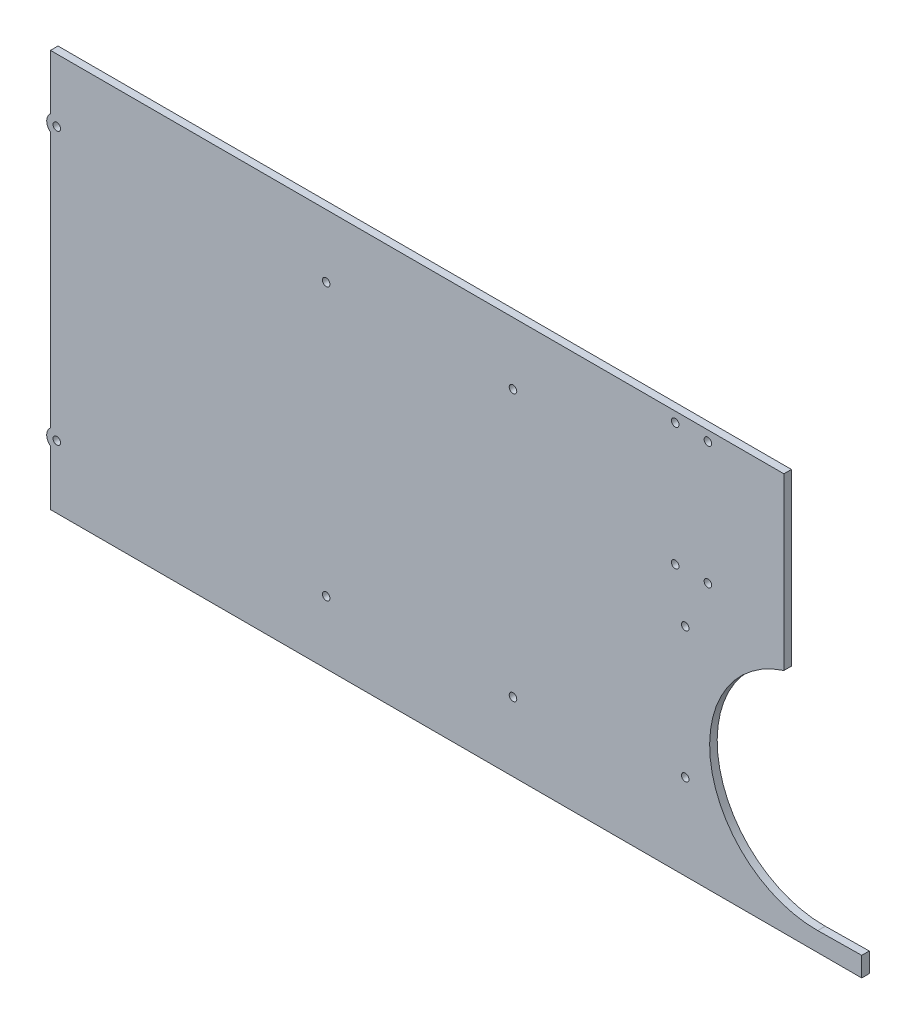
ISO-10303-21;
HEADER;
FILE_DESCRIPTION(('STEP AP214'),'2;1');
FILE_NAME('part.step','',(''),(''),'','','');
FILE_SCHEMA(('AUTOMOTIVE_DESIGN { 1 0 10303 214 1 1 1 1 }'));
ENDSEC;
DATA;
#1=APPLICATION_CONTEXT('core data for automotive mechanical design processes');
#2=APPLICATION_PROTOCOL_DEFINITION('international standard','automotive_design',2000,#1);
#3=PRODUCT_CONTEXT('',#1,'mechanical');
#4=PRODUCT('Part','Part','',(#3));
#5=PRODUCT_RELATED_PRODUCT_CATEGORY('part','',(#4));
#6=PRODUCT_DEFINITION_FORMATION('','',#4);
#7=PRODUCT_DEFINITION_CONTEXT('part definition',#1,'design');
#8=PRODUCT_DEFINITION('design','',#6,#7);
#9=PRODUCT_DEFINITION_SHAPE('','',#8);
#10=(LENGTH_UNIT() NAMED_UNIT(*) SI_UNIT(.MILLI.,.METRE.));
#11=(NAMED_UNIT(*) PLANE_ANGLE_UNIT() SI_UNIT($,.RADIAN.));
#12=(NAMED_UNIT(*) SI_UNIT($,.STERADIAN.) SOLID_ANGLE_UNIT());
#13=UNCERTAINTY_MEASURE_WITH_UNIT(LENGTH_MEASURE(1.E-05),#10,'distance_accuracy_value','');
#14=(GEOMETRIC_REPRESENTATION_CONTEXT(3) GLOBAL_UNCERTAINTY_ASSIGNED_CONTEXT((#13)) GLOBAL_UNIT_ASSIGNED_CONTEXT((#10,
#11,#12)) REPRESENTATION_CONTEXT('',''));
#15=CARTESIAN_POINT('',(0.,0.,0.));
#16=DIRECTION('',(0.,0.,1.));
#17=DIRECTION('',(1.,0.,0.));
#18=AXIS2_PLACEMENT_3D('',#15,#16,#17);
#19=CARTESIAN_POINT('',(-254.85091996247,60.2307423287891,3.));
#20=DIRECTION('',(1.,0.,0.));
#21=DIRECTION('',(0.,0.,-1.));
#22=AXIS2_PLACEMENT_3D('',#19,#20,#21);
#23=PLANE('',#22);
#24=DIRECTION('',(0.,-1.,0.));
#25=VECTOR('',#24,1.);
#26=CARTESIAN_POINT('',(-254.85091996247,60.2307423287891,0.));
#27=LINE('',#26,#25);
#28=CARTESIAN_POINT('',(-254.85091996247,60.2307423287891,0.));
#29=VERTEX_POINT('',#28);
#30=CARTESIAN_POINT('',(-254.85091996247,38.3486734286899,0.));
#31=VERTEX_POINT('',#30);
#32=EDGE_CURVE('E129',#29,#31,#27,.T.);
#33=ORIENTED_EDGE('',*,*,#32,.T.);
#34=DIRECTION('',(0.,0.,1.));
#35=VECTOR('',#34,1.);
#36=CARTESIAN_POINT('',(-254.85091996247,38.3486734286899,0.));
#37=LINE('',#36,#35);
#38=CARTESIAN_POINT('',(-254.85091996247,38.3486734286899,3.));
#39=VERTEX_POINT('',#38);
#40=EDGE_CURVE('E116',#31,#39,#37,.T.);
#41=ORIENTED_EDGE('',*,*,#40,.T.);
#42=DIRECTION('',(0.,-1.,0.));
#43=VECTOR('',#42,1.);
#44=CARTESIAN_POINT('',(-254.85091996247,60.2307423287891,3.));
#45=LINE('',#44,#43);
#46=CARTESIAN_POINT('',(-254.85091996247,60.2307423287891,3.));
#47=VERTEX_POINT('',#46);
#48=EDGE_CURVE('E127',#47,#39,#45,.T.);
#49=ORIENTED_EDGE('',*,*,#48,.F.);
#50=DIRECTION('',(0.,0.,-1.));
#51=VECTOR('',#50,1.);
#52=CARTESIAN_POINT('',(-254.85091996247,60.2307423287891,3.));
#53=LINE('',#52,#51);
#54=EDGE_CURVE('E156',#47,#29,#53,.T.);
#55=ORIENTED_EDGE('',*,*,#54,.T.);
#56=EDGE_LOOP('',(#33,#41,#49,#55));
#57=FACE_BOUND('',#56,.T.);
#58=ADVANCED_FACE('F32',(#57),#23,.F.);
#59=CARTESIAN_POINT('',(-254.85091996247,32.1036754302943,3.));
#60=VERTEX_POINT('',#59);
#61=CARTESIAN_POINT('',(-254.85091996247,-69.7967586720138,3.));
#62=VERTEX_POINT('',#61);
#63=EDGE_CURVE('E137',#60,#62,#45,.T.);
#64=ORIENTED_EDGE('',*,*,#63,.F.);
#65=DIRECTION('',(0.,0.,1.));
#66=VECTOR('',#65,1.);
#67=CARTESIAN_POINT('',(-254.85091996247,32.1036754302943,0.));
#68=LINE('',#67,#66);
#69=CARTESIAN_POINT('',(-254.85091996247,32.1036754302943,0.));
#70=VERTEX_POINT('',#69);
#71=EDGE_CURVE('E119',#60,#70,#68,.F.);
#72=ORIENTED_EDGE('',*,*,#71,.T.);
#73=CARTESIAN_POINT('',(-254.85091996247,-69.7967586720138,0.));
#74=VERTEX_POINT('',#73);
#75=EDGE_CURVE('E269',#70,#74,#27,.T.);
#76=ORIENTED_EDGE('',*,*,#75,.T.);
#77=DIRECTION('',(0.,0.,1.));
#78=VECTOR('',#77,1.);
#79=CARTESIAN_POINT('',(-254.85091996247,-69.7967586720138,0.));
#80=LINE('',#79,#78);
#81=EDGE_CURVE('E215',#74,#62,#80,.T.);
#82=ORIENTED_EDGE('',*,*,#81,.T.);
#83=EDGE_LOOP('',(#64,#72,#76,#82));
#84=FACE_BOUND('',#83,.T.);
#85=ADVANCED_FACE('F298',(#84),#23,.F.);
#86=CARTESIAN_POINT('',(-254.85091996247,-76.0417566704094,3.));
#87=VERTEX_POINT('',#86);
#88=CARTESIAN_POINT('',(-254.85091996247,-97.9238255705086,3.));
#89=VERTEX_POINT('',#88);
#90=EDGE_CURVE('E139',#87,#89,#45,.T.);
#91=ORIENTED_EDGE('',*,*,#90,.F.);
#92=DIRECTION('',(0.,0.,1.));
#93=VECTOR('',#92,1.);
#94=CARTESIAN_POINT('',(-254.85091996247,-76.0417566704094,0.));
#95=LINE('',#94,#93);
#96=CARTESIAN_POINT('',(-254.85091996247,-76.0417566704094,0.));
#97=VERTEX_POINT('',#96);
#98=EDGE_CURVE('E291',#87,#97,#95,.F.);
#99=ORIENTED_EDGE('',*,*,#98,.T.);
#100=CARTESIAN_POINT('',(-254.85091996247,-97.9238255705086,0.));
#101=VERTEX_POINT('',#100);
#102=EDGE_CURVE('E249',#97,#101,#27,.T.);
#103=ORIENTED_EDGE('',*,*,#102,.T.);
#104=DIRECTION('',(0.,0.,-1.));
#105=VECTOR('',#104,1.);
#106=CARTESIAN_POINT('',(-254.85091996247,-97.9238255705086,3.));
#107=LINE('',#106,#105);
#108=EDGE_CURVE('E11',#89,#101,#107,.T.);
#109=ORIENTED_EDGE('',*,*,#108,.F.);
#110=EDGE_LOOP('',(#91,#99,#103,#109));
#111=FACE_BOUND('',#110,.T.);
#112=ADVANCED_FACE('F34',(#111),#23,.F.);
#113=CARTESIAN_POINT('',(82.6773280375302,-97.9238255705086,3.));
#114=DIRECTION('',(0.,1.,0.));
#115=DIRECTION('',(-1.,0.,0.));
#116=AXIS2_PLACEMENT_3D('',#113,#114,#115);
#117=PLANE('',#116);
#118=DIRECTION('',(1.,0.,0.));
#119=VECTOR('',#118,1.);
#120=CARTESIAN_POINT('',(82.6773280375302,-97.9238255705086,0.));
#121=LINE('',#120,#119);
#122=CARTESIAN_POINT('',(67.7284164945036,-97.9238255705086,0.));
#123=VERTEX_POINT('',#122);
#124=EDGE_CURVE('E268',#101,#123,#121,.T.);
#125=ORIENTED_EDGE('',*,*,#124,.T.);
#126=DIRECTION('',(0.,0.,1.));
#127=VECTOR('',#126,1.);
#128=CARTESIAN_POINT('',(67.7284164945036,-97.9238255705086,0.));
#129=LINE('',#128,#127);
#130=CARTESIAN_POINT('',(67.7284164945036,-97.9238255705086,3.));
#131=VERTEX_POINT('',#130);
#132=EDGE_CURVE('E247',#123,#131,#129,.T.);
#133=ORIENTED_EDGE('',*,*,#132,.T.);
#134=DIRECTION('',(1.,0.,0.));
#135=VECTOR('',#134,1.);
#136=CARTESIAN_POINT('',(82.6773280375302,-97.9238255705086,3.));
#137=LINE('',#136,#135);
#138=EDGE_CURVE('E136',#89,#131,#137,.T.);
#139=ORIENTED_EDGE('',*,*,#138,.F.);
#140=ORIENTED_EDGE('',*,*,#108,.T.);
#141=EDGE_LOOP('',(#125,#133,#139,#140));
#142=FACE_BOUND('',#141,.T.);
#143=ADVANCED_FACE('F304',(#142),#117,.F.);
#144=CARTESIAN_POINT('',(50.2241898152786,-90.3422144189195,3.));
#145=DIRECTION('',(0.0128910209084462,-0.999916907337773,0.));
#146=DIRECTION('',(0.999916907337774,0.0128910209084462,0.));
#147=AXIS2_PLACEMENT_3D('',#144,#145,#146);
#148=PLANE('',#147);
#149=DIRECTION('',(-0.999916907337774,-0.0128910209084462,0.));
#150=VECTOR('',#149,1.);
#151=CARTESIAN_POINT('',(50.2241898152786,-90.3422144189195,3.));
#152=LINE('',#151,#150);
#153=CARTESIAN_POINT('',(67.7284164945036,-90.1165483156142,3.));
#154=VERTEX_POINT('',#153);
#155=CARTESIAN_POINT('',(50.2241898152786,-90.3422144189195,3.));
#156=VERTEX_POINT('',#155);
#157=EDGE_CURVE('E141',#154,#156,#152,.T.);
#158=ORIENTED_EDGE('',*,*,#157,.F.);
#159=DIRECTION('',(0.,0.,1.));
#160=VECTOR('',#159,1.);
#161=CARTESIAN_POINT('',(67.7284164945036,-90.1165483156142,0.));
#162=LINE('',#161,#160);
#163=CARTESIAN_POINT('',(67.7284164945036,-90.1165483156142,0.));
#164=VERTEX_POINT('',#163);
#165=EDGE_CURVE('E245',#164,#154,#162,.T.);
#166=ORIENTED_EDGE('',*,*,#165,.F.);
#167=DIRECTION('',(-0.999916907337774,-0.0128910209084462,0.));
#168=VECTOR('',#167,1.);
#169=CARTESIAN_POINT('',(50.2241898152786,-90.3422144189195,0.));
#170=LINE('',#169,#168);
#171=CARTESIAN_POINT('',(50.2241898152786,-90.3422144189195,0.));
#172=VERTEX_POINT('',#171);
#173=EDGE_CURVE('E272',#164,#172,#170,.T.);
#174=ORIENTED_EDGE('',*,*,#173,.T.);
#175=DIRECTION('',(0.,0.,-1.));
#176=VECTOR('',#175,1.);
#177=CARTESIAN_POINT('',(50.2241898152786,-90.3422144189195,3.));
#178=LINE('',#177,#176);
#179=EDGE_CURVE('E41',#156,#172,#178,.T.);
#180=ORIENTED_EDGE('',*,*,#179,.F.);
#181=EDGE_LOOP('',(#158,#166,#174,#180));
#182=FACE_BOUND('',#181,.T.);
#183=ADVANCED_FACE('F258',(#182),#148,.F.);
#184=CARTESIAN_POINT('',(49.6773280375301,-47.9238255705086,3.));
#185=DIRECTION('',(0.,0.,-1.));
#186=DIRECTION('',(-1.,0.,0.));
#187=AXIS2_PLACEMENT_3D('',#184,#185,#186);
#188=CYLINDRICAL_SURFACE('',#187,42.4219137981652);
#189=CARTESIAN_POINT('',(49.6773280375301,-47.9238255705086,0.));
#190=DIRECTION('',(0.,0.,-1.));
#191=DIRECTION('',(1.,0.,0.));
#192=AXIS2_PLACEMENT_3D('',#189,#190,#191);
#193=CIRCLE('',#192,42.4219137981652);
#194=CARTESIAN_POINT('',(36.781104637515,-7.50964251163856,0.));
#195=VERTEX_POINT('',#194);
#196=EDGE_CURVE('E152',#172,#195,#193,.T.);
#197=ORIENTED_EDGE('',*,*,#196,.T.);
#198=DIRECTION('',(0.,0.,-1.));
#199=VECTOR('',#198,1.);
#200=CARTESIAN_POINT('',(36.781104637515,-7.50964251163856,3.));
#201=LINE('',#200,#199);
#202=CARTESIAN_POINT('',(36.781104637515,-7.50964251163856,3.));
#203=VERTEX_POINT('',#202);
#204=EDGE_CURVE('E160',#203,#195,#201,.T.);
#205=ORIENTED_EDGE('',*,*,#204,.F.);
#206=CARTESIAN_POINT('',(49.6773280375301,-47.9238255705086,3.));
#207=DIRECTION('',(0.,0.,-1.));
#208=DIRECTION('',(1.,0.,0.));
#209=AXIS2_PLACEMENT_3D('',#206,#207,#208);
#210=CIRCLE('',#209,42.4219137981652);
#211=EDGE_CURVE('E260',#156,#203,#210,.T.);
#212=ORIENTED_EDGE('',*,*,#211,.F.);
#213=ORIENTED_EDGE('',*,*,#179,.T.);
#214=EDGE_LOOP('',(#197,#205,#212,#213));
#215=FACE_BOUND('',#214,.T.);
#216=ADVANCED_FACE('F276',(#215),#188,.F.);
#217=CARTESIAN_POINT('',(36.781104637515,60.230742328789,3.));
#218=DIRECTION('',(-1.,0.,0.));
#219=DIRECTION('',(0.,-1.,0.));
#220=AXIS2_PLACEMENT_3D('',#217,#218,#219);
#221=PLANE('',#220);
#222=DIRECTION('',(0.,1.,0.));
#223=VECTOR('',#222,1.);
#224=CARTESIAN_POINT('',(36.781104637515,60.230742328789,0.));
#225=LINE('',#224,#223);
#226=CARTESIAN_POINT('',(36.781104637515,60.230742328789,0.));
#227=VERTEX_POINT('',#226);
#228=EDGE_CURVE('E147',#195,#227,#225,.T.);
#229=ORIENTED_EDGE('',*,*,#228,.T.);
#230=DIRECTION('',(0.,0.,-1.));
#231=VECTOR('',#230,1.);
#232=CARTESIAN_POINT('',(36.781104637515,60.230742328789,3.));
#233=LINE('',#232,#231);
#234=CARTESIAN_POINT('',(36.781104637515,60.230742328789,3.));
#235=VERTEX_POINT('',#234);
#236=EDGE_CURVE('E158',#235,#227,#233,.T.);
#237=ORIENTED_EDGE('',*,*,#236,.F.);
#238=DIRECTION('',(0.,1.,0.));
#239=VECTOR('',#238,1.);
#240=CARTESIAN_POINT('',(36.781104637515,60.230742328789,3.));
#241=LINE('',#240,#239);
#242=EDGE_CURVE('E262',#203,#235,#241,.T.);
#243=ORIENTED_EDGE('',*,*,#242,.F.);
#244=ORIENTED_EDGE('',*,*,#204,.T.);
#245=EDGE_LOOP('',(#229,#237,#243,#244));
#246=FACE_BOUND('',#245,.T.);
#247=ADVANCED_FACE('F281',(#246),#221,.F.);
#248=CARTESIAN_POINT('',(-254.85091996247,60.2307423287891,3.));
#249=DIRECTION('',(0.,-1.,0.));
#250=DIRECTION('',(1.,0.,0.));
#251=AXIS2_PLACEMENT_3D('',#248,#249,#250);
#252=PLANE('',#251);
#253=DIRECTION('',(-1.,0.,0.));
#254=VECTOR('',#253,1.);
#255=CARTESIAN_POINT('',(-254.85091996247,60.2307423287891,0.));
#256=LINE('',#255,#254);
#257=EDGE_CURVE('E144',#227,#29,#256,.T.);
#258=ORIENTED_EDGE('',*,*,#257,.T.);
#259=ORIENTED_EDGE('',*,*,#54,.F.);
#260=DIRECTION('',(-1.,0.,0.));
#261=VECTOR('',#260,1.);
#262=CARTESIAN_POINT('',(-254.85091996247,60.2307423287891,3.));
#263=LINE('',#262,#261);
#264=EDGE_CURVE('E134',#235,#47,#263,.T.);
#265=ORIENTED_EDGE('',*,*,#264,.F.);
#266=ORIENTED_EDGE('',*,*,#236,.T.);
#267=EDGE_LOOP('',(#258,#259,#265,#266));
#268=FACE_BOUND('',#267,.T.);
#269=ADVANCED_FACE('F331',(#268),#252,.F.);
#270=CARTESIAN_POINT('',(49.6773280375301,-47.9238255705086,3.));
#271=DIRECTION('',(0.,0.,1.));
#272=DIRECTION('',(1.,0.,0.));
#273=AXIS2_PLACEMENT_3D('',#270,#271,#272);
#274=PLANE('',#273);
#275=ORIENTED_EDGE('',*,*,#48,.T.);
#276=CARTESIAN_POINT('',(-252.350919962468,35.2261744294921,3.));
#277=DIRECTION('',(0.,0.,1.));
#278=DIRECTION('',(1.,0.,0.));
#279=AXIS2_PLACEMENT_3D('',#276,#277,#278);
#280=CIRCLE('',#279,3.99999999999999);
#281=EDGE_CURVE('E49',#39,#60,#280,.T.);
#282=ORIENTED_EDGE('',*,*,#281,.T.);
#283=ORIENTED_EDGE('',*,*,#63,.T.);
#284=CARTESIAN_POINT('',(-252.350919962468,-72.9192576712116,3.));
#285=DIRECTION('',(0.,0.,1.));
#286=DIRECTION('',(1.,0.,0.));
#287=AXIS2_PLACEMENT_3D('',#284,#285,#286);
#288=CIRCLE('',#287,3.99999999999999);
#289=EDGE_CURVE('E55',#62,#87,#288,.T.);
#290=ORIENTED_EDGE('',*,*,#289,.T.);
#291=ORIENTED_EDGE('',*,*,#90,.T.);
#292=ORIENTED_EDGE('',*,*,#138,.T.);
#293=DIRECTION('',(0.,-1.,0.));
#294=VECTOR('',#293,1.);
#295=CARTESIAN_POINT('',(67.7284164945036,-97.9238255705086,3.));
#296=LINE('',#295,#294);
#297=EDGE_CURVE('E172',#154,#131,#296,.T.);
#298=ORIENTED_EDGE('',*,*,#297,.F.);
#299=ORIENTED_EDGE('',*,*,#157,.T.);
#300=ORIENTED_EDGE('',*,*,#211,.T.);
#301=ORIENTED_EDGE('',*,*,#242,.T.);
#302=ORIENTED_EDGE('',*,*,#264,.T.);
#303=EDGE_LOOP('',(#275,#282,#283,#290,#291,#292,#298,#299,#300,#301,#302));
#304=FACE_BOUND('',#303,.T.);
#305=CARTESIAN_POINT('',(-145.230919962485,-72.9238255705085,3.));
#306=DIRECTION('',(0.,0.,1.));
#307=DIRECTION('',(-1.,0.,0.));
#308=AXIS2_PLACEMENT_3D('',#305,#306,#307);
#309=CIRCLE('',#308,1.5);
#310=CARTESIAN_POINT('',(-146.730919962485,-72.9238255705085,3.));
#311=VERTEX_POINT('',#310);
#312=EDGE_CURVE('E199',#311,#311,#309,.T.);
#313=ORIENTED_EDGE('',*,*,#312,.F.);
#314=EDGE_LOOP('',(#313));
#315=FACE_BOUND('',#314,.T.);
#316=CARTESIAN_POINT('',(-145.230919962485,35.230742328789,3.));
#317=DIRECTION('',(0.,0.,1.));
#318=DIRECTION('',(1.,0.,0.));
#319=AXIS2_PLACEMENT_3D('',#316,#317,#318);
#320=CIRCLE('',#319,1.5);
#321=CARTESIAN_POINT('',(-143.730919962485,35.230742328789,3.));
#322=VERTEX_POINT('',#321);
#323=EDGE_CURVE('E208',#322,#322,#320,.T.);
#324=ORIENTED_EDGE('',*,*,#323,.F.);
#325=EDGE_LOOP('',(#324));
#326=FACE_BOUND('',#325,.T.);
#327=CARTESIAN_POINT('',(-6.43991593951062,56.2307423287891,3.));
#328=DIRECTION('',(0.,0.,1.));
#329=DIRECTION('',(1.,0.,0.));
#330=AXIS2_PLACEMENT_3D('',#327,#328,#329);
#331=CIRCLE('',#330,1.5);
#332=CARTESIAN_POINT('',(-4.93991593951062,56.2307423287891,3.));
#333=VERTEX_POINT('',#332);
#334=EDGE_CURVE('E227',#333,#333,#331,.T.);
#335=ORIENTED_EDGE('',*,*,#334,.F.);
#336=EDGE_LOOP('',(#335));
#337=FACE_BOUND('',#336,.T.);
#338=CARTESIAN_POINT('',(6.56008406048935,7.43074232878906,3.));
#339=DIRECTION('',(0.,0.,1.));
#340=DIRECTION('',(-1.,0.,0.));
#341=AXIS2_PLACEMENT_3D('',#338,#339,#340);
#342=CIRCLE('',#341,1.49999999999998);
#343=CARTESIAN_POINT('',(5.06008406048937,7.43074232878906,3.));
#344=VERTEX_POINT('',#343);
#345=EDGE_CURVE('E226',#344,#344,#342,.T.);
#346=ORIENTED_EDGE('',*,*,#345,.F.);
#347=EDGE_LOOP('',(#346));
#348=FACE_BOUND('',#347,.T.);
#349=CARTESIAN_POINT('',(-6.43991593951062,7.43074232878906,3.));
#350=DIRECTION('',(0.,0.,1.));
#351=DIRECTION('',(-1.,0.,0.));
#352=AXIS2_PLACEMENT_3D('',#349,#350,#351);
#353=CIRCLE('',#352,1.5);
#354=CARTESIAN_POINT('',(-7.93991593951062,7.43074232878906,3.));
#355=VERTEX_POINT('',#354);
#356=EDGE_CURVE('E201',#355,#355,#353,.T.);
#357=ORIENTED_EDGE('',*,*,#356,.F.);
#358=EDGE_LOOP('',(#357));
#359=FACE_BOUND('',#358,.T.);
#360=CARTESIAN_POINT('',(6.56008406048937,56.2307423287891,3.));
#361=DIRECTION('',(0.,0.,1.));
#362=DIRECTION('',(1.,0.,0.));
#363=AXIS2_PLACEMENT_3D('',#360,#361,#362);
#364=CIRCLE('',#363,1.49999999999998);
#365=CARTESIAN_POINT('',(8.06008406048934,56.2307423287891,3.));
#366=VERTEX_POINT('',#365);
#367=EDGE_CURVE('E185',#366,#366,#364,.T.);
#368=ORIENTED_EDGE('',*,*,#367,.F.);
#369=EDGE_LOOP('',(#368));
#370=FACE_BOUND('',#369,.T.);
#371=CARTESIAN_POINT('',(-70.942671962485,35.5075380293095,3.));
#372=DIRECTION('',(0.,0.,1.));
#373=DIRECTION('',(1.,0.,0.));
#374=AXIS2_PLACEMENT_3D('',#371,#372,#373);
#375=CIRCLE('',#374,1.49999999999994);
#376=CARTESIAN_POINT('',(-69.4426719624851,35.5075380293095,3.));
#377=VERTEX_POINT('',#376);
#378=EDGE_CURVE('E177',#377,#377,#375,.T.);
#379=ORIENTED_EDGE('',*,*,#378,.F.);
#380=EDGE_LOOP('',(#379));
#381=FACE_BOUND('',#380,.T.);
#382=CARTESIAN_POINT('',(-70.942671962485,-70.4924619706905,3.));
#383=DIRECTION('',(0.,0.,1.));
#384=DIRECTION('',(1.,0.,0.));
#385=AXIS2_PLACEMENT_3D('',#382,#383,#384);
#386=CIRCLE('',#385,1.5);
#387=CARTESIAN_POINT('',(-69.442671962485,-70.4924619706905,3.));
#388=VERTEX_POINT('',#387);
#389=EDGE_CURVE('E194',#388,#388,#386,.T.);
#390=ORIENTED_EDGE('',*,*,#389,.F.);
#391=EDGE_LOOP('',(#390));
#392=FACE_BOUND('',#391,.T.);
#393=CARTESIAN_POINT('',(-2.44267196248502,-11.9238255705082,3.));
#394=DIRECTION('',(0.,0.,1.));
#395=DIRECTION('',(1.,0.,0.));
#396=AXIS2_PLACEMENT_3D('',#393,#394,#395);
#397=CIRCLE('',#396,1.49999999999994);
#398=CARTESIAN_POINT('',(-0.942671962485079,-11.9238255705082,3.));
#399=VERTEX_POINT('',#398);
#400=EDGE_CURVE('E169',#399,#399,#397,.T.);
#401=ORIENTED_EDGE('',*,*,#400,.F.);
#402=EDGE_LOOP('',(#401));
#403=FACE_BOUND('',#402,.T.);
#404=CARTESIAN_POINT('',(-2.44267196248502,-63.9238255705082,3.));
#405=DIRECTION('',(0.,0.,1.));
#406=DIRECTION('',(1.,0.,0.));
#407=AXIS2_PLACEMENT_3D('',#404,#405,#406);
#408=CIRCLE('',#407,1.5);
#409=CARTESIAN_POINT('',(-0.942671962485014,-63.9238255705082,3.));
#410=VERTEX_POINT('',#409);
#411=EDGE_CURVE('E180',#410,#410,#408,.T.);
#412=ORIENTED_EDGE('',*,*,#411,.F.);
#413=EDGE_LOOP('',(#412));
#414=FACE_BOUND('',#413,.T.);
#415=CARTESIAN_POINT('',(-252.350919962468,-72.9192576712116,3.));
#416=DIRECTION('',(0.,0.,1.));
#417=DIRECTION('',(1.,0.,0.));
#418=AXIS2_PLACEMENT_3D('',#415,#416,#417);
#419=CIRCLE('',#418,1.50000000000002);
#420=CARTESIAN_POINT('',(-250.850919962468,-72.9192576712116,3.));
#421=VERTEX_POINT('',#420);
#422=EDGE_CURVE('E210',#421,#421,#419,.T.);
#423=ORIENTED_EDGE('',*,*,#422,.F.);
#424=EDGE_LOOP('',(#423));
#425=FACE_BOUND('',#424,.T.);
#426=CARTESIAN_POINT('',(-252.350919962468,35.2261744294921,3.));
#427=DIRECTION('',(0.,0.,1.));
#428=DIRECTION('',(-1.,0.,0.));
#429=AXIS2_PLACEMENT_3D('',#426,#427,#428);
#430=CIRCLE('',#429,1.50000000000002);
#431=CARTESIAN_POINT('',(-253.850919962468,35.2261744294921,3.));
#432=VERTEX_POINT('',#431);
#433=EDGE_CURVE('E204',#432,#432,#430,.T.);
#434=ORIENTED_EDGE('',*,*,#433,.F.);
#435=EDGE_LOOP('',(#434));
#436=FACE_BOUND('',#435,.T.);
#437=ADVANCED_FACE('F131',(#304,#315,#326,#337,#348,#359,#370,#381,#392,#403,#414,#425,#436),
#274,.T.);
#438=CARTESIAN_POINT('',(49.6773280375301,-47.9238255705086,0.));
#439=DIRECTION('',(0.,0.,1.));
#440=DIRECTION('',(1.,0.,0.));
#441=AXIS2_PLACEMENT_3D('',#438,#439,#440);
#442=PLANE('',#441);
#443=CARTESIAN_POINT('',(-145.230919962485,-72.9238255705085,0.));
#444=DIRECTION('',(0.,0.,1.));
#445=DIRECTION('',(1.,0.,0.));
#446=AXIS2_PLACEMENT_3D('',#443,#444,#445);
#447=CIRCLE('',#446,1.5);
#448=CARTESIAN_POINT('',(-143.730919962485,-72.9238255705085,0.));
#449=VERTEX_POINT('',#448);
#450=EDGE_CURVE('E198',#449,#449,#447,.T.);
#451=ORIENTED_EDGE('',*,*,#450,.T.);
#452=EDGE_LOOP('',(#451));
#453=FACE_BOUND('',#452,.T.);
#454=CARTESIAN_POINT('',(-145.230919962485,35.230742328789,0.));
#455=DIRECTION('',(0.,0.,1.));
#456=DIRECTION('',(1.,0.,0.));
#457=AXIS2_PLACEMENT_3D('',#454,#455,#456);
#458=CIRCLE('',#457,1.5);
#459=CARTESIAN_POINT('',(-143.730919962485,35.230742328789,0.));
#460=VERTEX_POINT('',#459);
#461=EDGE_CURVE('E195',#460,#460,#458,.T.);
#462=ORIENTED_EDGE('',*,*,#461,.T.);
#463=EDGE_LOOP('',(#462));
#464=FACE_BOUND('',#463,.T.);
#465=CARTESIAN_POINT('',(-6.43991593951062,56.2307423287891,0.));
#466=DIRECTION('',(0.,0.,1.));
#467=DIRECTION('',(1.,0.,0.));
#468=AXIS2_PLACEMENT_3D('',#465,#466,#467);
#469=CIRCLE('',#468,1.5);
#470=CARTESIAN_POINT('',(-4.93991593951062,56.2307423287891,0.));
#471=VERTEX_POINT('',#470);
#472=EDGE_CURVE('E191',#471,#471,#469,.T.);
#473=ORIENTED_EDGE('',*,*,#472,.T.);
#474=EDGE_LOOP('',(#473));
#475=FACE_BOUND('',#474,.T.);
#476=CARTESIAN_POINT('',(6.56008406048935,7.43074232878906,0.));
#477=DIRECTION('',(0.,0.,1.));
#478=DIRECTION('',(1.,0.,0.));
#479=AXIS2_PLACEMENT_3D('',#476,#477,#478);
#480=CIRCLE('',#479,1.49999999999998);
#481=CARTESIAN_POINT('',(8.06008406048933,7.43074232878906,0.));
#482=VERTEX_POINT('',#481);
#483=EDGE_CURVE('E188',#482,#482,#480,.T.);
#484=ORIENTED_EDGE('',*,*,#483,.T.);
#485=EDGE_LOOP('',(#484));
#486=FACE_BOUND('',#485,.T.);
#487=CARTESIAN_POINT('',(-6.43991593951062,7.43074232878906,0.));
#488=DIRECTION('',(0.,0.,1.));
#489=DIRECTION('',(1.,0.,0.));
#490=AXIS2_PLACEMENT_3D('',#487,#488,#489);
#491=CIRCLE('',#490,1.5);
#492=CARTESIAN_POINT('',(-4.93991593951062,7.43074232878906,0.));
#493=VERTEX_POINT('',#492);
#494=EDGE_CURVE('E184',#493,#493,#491,.T.);
#495=ORIENTED_EDGE('',*,*,#494,.T.);
#496=EDGE_LOOP('',(#495));
#497=FACE_BOUND('',#496,.T.);
#498=CARTESIAN_POINT('',(6.56008406048937,56.2307423287891,0.));
#499=DIRECTION('',(0.,0.,1.));
#500=DIRECTION('',(1.,0.,0.));
#501=AXIS2_PLACEMENT_3D('',#498,#499,#500);
#502=CIRCLE('',#501,1.49999999999998);
#503=CARTESIAN_POINT('',(8.06008406048934,56.2307423287891,0.));
#504=VERTEX_POINT('',#503);
#505=EDGE_CURVE('E181',#504,#504,#502,.T.);
#506=ORIENTED_EDGE('',*,*,#505,.T.);
#507=EDGE_LOOP('',(#506));
#508=FACE_BOUND('',#507,.T.);
#509=CARTESIAN_POINT('',(-70.942671962485,35.5075380293095,0.));
#510=DIRECTION('',(0.,0.,1.));
#511=DIRECTION('',(1.,0.,0.));
#512=AXIS2_PLACEMENT_3D('',#509,#510,#511);
#513=CIRCLE('',#512,1.49999999999994);
#514=CARTESIAN_POINT('',(-69.4426719624851,35.5075380293095,0.));
#515=VERTEX_POINT('',#514);
#516=EDGE_CURVE('E176',#515,#515,#513,.T.);
#517=ORIENTED_EDGE('',*,*,#516,.T.);
#518=EDGE_LOOP('',(#517));
#519=FACE_BOUND('',#518,.T.);
#520=CARTESIAN_POINT('',(-70.942671962485,-70.4924619706905,0.));
#521=DIRECTION('',(0.,0.,1.));
#522=DIRECTION('',(1.,0.,0.));
#523=AXIS2_PLACEMENT_3D('',#520,#521,#522);
#524=CIRCLE('',#523,1.5);
#525=CARTESIAN_POINT('',(-69.442671962485,-70.4924619706905,0.));
#526=VERTEX_POINT('',#525);
#527=EDGE_CURVE('E173',#526,#526,#524,.T.);
#528=ORIENTED_EDGE('',*,*,#527,.T.);
#529=EDGE_LOOP('',(#528));
#530=FACE_BOUND('',#529,.T.);
#531=CARTESIAN_POINT('',(-2.44267196248502,-11.9238255705082,0.));
#532=DIRECTION('',(0.,0.,1.));
#533=DIRECTION('',(1.,0.,0.));
#534=AXIS2_PLACEMENT_3D('',#531,#532,#533);
#535=CIRCLE('',#534,1.49999999999994);
#536=CARTESIAN_POINT('',(-0.942671962485079,-11.9238255705082,0.));
#537=VERTEX_POINT('',#536);
#538=EDGE_CURVE('E168',#537,#537,#535,.T.);
#539=ORIENTED_EDGE('',*,*,#538,.T.);
#540=EDGE_LOOP('',(#539));
#541=FACE_BOUND('',#540,.T.);
#542=CARTESIAN_POINT('',(-2.44267196248502,-63.9238255705082,0.));
#543=DIRECTION('',(0.,0.,1.));
#544=DIRECTION('',(1.,0.,0.));
#545=AXIS2_PLACEMENT_3D('',#542,#543,#544);
#546=CIRCLE('',#545,1.5);
#547=CARTESIAN_POINT('',(-0.942671962485014,-63.9238255705082,0.));
#548=VERTEX_POINT('',#547);
#549=EDGE_CURVE('E165',#548,#548,#546,.T.);
#550=ORIENTED_EDGE('',*,*,#549,.T.);
#551=EDGE_LOOP('',(#550));
#552=FACE_BOUND('',#551,.T.);
#553=ORIENTED_EDGE('',*,*,#75,.F.);
#554=CARTESIAN_POINT('',(-252.350919962468,35.2261744294921,0.));
#555=DIRECTION('',(0.,0.,1.));
#556=DIRECTION('',(1.,0.,0.));
#557=AXIS2_PLACEMENT_3D('',#554,#555,#556);
#558=CIRCLE('',#557,3.99999999999999);
#559=EDGE_CURVE('E121',#31,#70,#558,.T.);
#560=ORIENTED_EDGE('',*,*,#559,.F.);
#561=ORIENTED_EDGE('',*,*,#32,.F.);
#562=ORIENTED_EDGE('',*,*,#257,.F.);
#563=ORIENTED_EDGE('',*,*,#228,.F.);
#564=ORIENTED_EDGE('',*,*,#196,.F.);
#565=ORIENTED_EDGE('',*,*,#173,.F.);
#566=DIRECTION('',(0.,-1.,0.));
#567=VECTOR('',#566,1.);
#568=CARTESIAN_POINT('',(67.7284164945036,-97.9238255705086,0.));
#569=LINE('',#568,#567);
#570=EDGE_CURVE('E242',#164,#123,#569,.T.);
#571=ORIENTED_EDGE('',*,*,#570,.T.);
#572=ORIENTED_EDGE('',*,*,#124,.F.);
#573=ORIENTED_EDGE('',*,*,#102,.F.);
#574=CARTESIAN_POINT('',(-252.350919962468,-72.9192576712116,0.));
#575=DIRECTION('',(0.,0.,1.));
#576=DIRECTION('',(1.,0.,0.));
#577=AXIS2_PLACEMENT_3D('',#574,#575,#576);
#578=CIRCLE('',#577,3.99999999999999);
#579=EDGE_CURVE('E289',#74,#97,#578,.T.);
#580=ORIENTED_EDGE('',*,*,#579,.F.);
#581=EDGE_LOOP('',(#553,#560,#561,#562,#563,#564,#565,#571,#572,#573,#580));
#582=FACE_BOUND('',#581,.T.);
#583=CARTESIAN_POINT('',(-252.350919962468,-72.9192576712116,0.));
#584=DIRECTION('',(0.,0.,1.));
#585=DIRECTION('',(1.,0.,0.));
#586=AXIS2_PLACEMENT_3D('',#583,#584,#585);
#587=CIRCLE('',#586,1.50000000000002);
#588=CARTESIAN_POINT('',(-250.850919962468,-72.9192576712116,0.));
#589=VERTEX_POINT('',#588);
#590=EDGE_CURVE('E202',#589,#589,#587,.T.);
#591=ORIENTED_EDGE('',*,*,#590,.T.);
#592=EDGE_LOOP('',(#591));
#593=FACE_BOUND('',#592,.T.);
#594=CARTESIAN_POINT('',(-252.350919962468,35.2261744294921,0.));
#595=DIRECTION('',(0.,0.,1.));
#596=DIRECTION('',(1.,0.,0.));
#597=AXIS2_PLACEMENT_3D('',#594,#595,#596);
#598=CIRCLE('',#597,1.50000000000002);
#599=CARTESIAN_POINT('',(-250.850919962468,35.2261744294921,0.));
#600=VERTEX_POINT('',#599);
#601=EDGE_CURVE('E36',#600,#600,#598,.T.);
#602=ORIENTED_EDGE('',*,*,#601,.T.);
#603=EDGE_LOOP('',(#602));
#604=FACE_BOUND('',#603,.T.);
#605=ADVANCED_FACE('F284',(#453,#464,#475,#486,#497,#508,#519,#530,#541,#552,#582,#593,#604),
#442,.F.);
#606=CARTESIAN_POINT('',(67.7284164945036,-97.9238255705086,0.));
#607=DIRECTION('',(-1.,0.,0.));
#608=DIRECTION('',(0.,0.,1.));
#609=AXIS2_PLACEMENT_3D('',#606,#607,#608);
#610=PLANE('',#609);
#611=ORIENTED_EDGE('',*,*,#297,.T.);
#612=ORIENTED_EDGE('',*,*,#132,.F.);
#613=ORIENTED_EDGE('',*,*,#570,.F.);
#614=ORIENTED_EDGE('',*,*,#165,.T.);
#615=EDGE_LOOP('',(#611,#612,#613,#614));
#616=FACE_BOUND('',#615,.T.);
#617=ADVANCED_FACE('F253',(#616),#610,.F.);
#618=CARTESIAN_POINT('',(-2.44267196248502,-63.9238255705082,-1.));
#619=DIRECTION('',(0.,0.,1.));
#620=DIRECTION('',(1.,0.,0.));
#621=AXIS2_PLACEMENT_3D('',#618,#619,#620);
#622=CYLINDRICAL_SURFACE('',#621,1.5);
#623=ORIENTED_EDGE('',*,*,#411,.T.);
#624=EDGE_LOOP('',(#623));
#625=FACE_BOUND('',#624,.T.);
#626=ORIENTED_EDGE('',*,*,#549,.F.);
#627=EDGE_LOOP('',(#626));
#628=FACE_BOUND('',#627,.T.);
#629=ADVANCED_FACE('F407',(#625,#628),#622,.F.);
#630=CARTESIAN_POINT('',(-2.44267196248502,-11.9238255705082,-1.));
#631=DIRECTION('',(0.,0.,1.));
#632=DIRECTION('',(1.,0.,0.));
#633=AXIS2_PLACEMENT_3D('',#630,#631,#632);
#634=CYLINDRICAL_SURFACE('',#633,1.49999999999994);
#635=ORIENTED_EDGE('',*,*,#400,.T.);
#636=EDGE_LOOP('',(#635));
#637=FACE_BOUND('',#636,.T.);
#638=ORIENTED_EDGE('',*,*,#538,.F.);
#639=EDGE_LOOP('',(#638));
#640=FACE_BOUND('',#639,.T.);
#641=ADVANCED_FACE('F403',(#637,#640),#634,.F.);
#642=CARTESIAN_POINT('',(-70.942671962485,-70.4924619706905,-1.));
#643=DIRECTION('',(0.,0.,1.));
#644=DIRECTION('',(1.,0.,0.));
#645=AXIS2_PLACEMENT_3D('',#642,#643,#644);
#646=CYLINDRICAL_SURFACE('',#645,1.5);
#647=ORIENTED_EDGE('',*,*,#389,.T.);
#648=EDGE_LOOP('',(#647));
#649=FACE_BOUND('',#648,.T.);
#650=ORIENTED_EDGE('',*,*,#527,.F.);
#651=EDGE_LOOP('',(#650));
#652=FACE_BOUND('',#651,.T.);
#653=ADVANCED_FACE('F399',(#649,#652),#646,.F.);
#654=CARTESIAN_POINT('',(-70.942671962485,35.5075380293095,-1.));
#655=DIRECTION('',(0.,0.,1.));
#656=DIRECTION('',(1.,0.,0.));
#657=AXIS2_PLACEMENT_3D('',#654,#655,#656);
#658=CYLINDRICAL_SURFACE('',#657,1.49999999999994);
#659=ORIENTED_EDGE('',*,*,#378,.T.);
#660=EDGE_LOOP('',(#659));
#661=FACE_BOUND('',#660,.T.);
#662=ORIENTED_EDGE('',*,*,#516,.F.);
#663=EDGE_LOOP('',(#662));
#664=FACE_BOUND('',#663,.T.);
#665=ADVANCED_FACE('F395',(#661,#664),#658,.F.);
#666=CARTESIAN_POINT('',(6.56008406048937,56.2307423287891,-7.));
#667=DIRECTION('',(0.,0.,1.));
#668=DIRECTION('',(1.,0.,0.));
#669=AXIS2_PLACEMENT_3D('',#666,#667,#668);
#670=CYLINDRICAL_SURFACE('',#669,1.49999999999998);
#671=ORIENTED_EDGE('',*,*,#367,.T.);
#672=EDGE_LOOP('',(#671));
#673=FACE_BOUND('',#672,.T.);
#674=ORIENTED_EDGE('',*,*,#505,.F.);
#675=EDGE_LOOP('',(#674));
#676=FACE_BOUND('',#675,.T.);
#677=ADVANCED_FACE('F385',(#673,#676),#670,.F.);
#678=CARTESIAN_POINT('',(-6.43991593951062,7.43074232878906,-7.));
#679=DIRECTION('',(0.,0.,1.));
#680=DIRECTION('',(1.,0.,0.));
#681=AXIS2_PLACEMENT_3D('',#678,#679,#680);
#682=CYLINDRICAL_SURFACE('',#681,1.5);
#683=ORIENTED_EDGE('',*,*,#356,.T.);
#684=EDGE_LOOP('',(#683));
#685=FACE_BOUND('',#684,.T.);
#686=ORIENTED_EDGE('',*,*,#494,.F.);
#687=EDGE_LOOP('',(#686));
#688=FACE_BOUND('',#687,.T.);
#689=ADVANCED_FACE('F381',(#685,#688),#682,.F.);
#690=CARTESIAN_POINT('',(6.56008406048935,7.43074232878906,-7.));
#691=DIRECTION('',(0.,0.,1.));
#692=DIRECTION('',(1.,0.,0.));
#693=AXIS2_PLACEMENT_3D('',#690,#691,#692);
#694=CYLINDRICAL_SURFACE('',#693,1.49999999999998);
#695=ORIENTED_EDGE('',*,*,#345,.T.);
#696=EDGE_LOOP('',(#695));
#697=FACE_BOUND('',#696,.T.);
#698=ORIENTED_EDGE('',*,*,#483,.F.);
#699=EDGE_LOOP('',(#698));
#700=FACE_BOUND('',#699,.T.);
#701=ADVANCED_FACE('F384',(#697,#700),#694,.F.);
#702=CARTESIAN_POINT('',(-6.43991593951062,56.2307423287891,-7.));
#703=DIRECTION('',(0.,0.,1.));
#704=DIRECTION('',(1.,0.,0.));
#705=AXIS2_PLACEMENT_3D('',#702,#703,#704);
#706=CYLINDRICAL_SURFACE('',#705,1.5);
#707=ORIENTED_EDGE('',*,*,#334,.T.);
#708=EDGE_LOOP('',(#707));
#709=FACE_BOUND('',#708,.T.);
#710=ORIENTED_EDGE('',*,*,#472,.F.);
#711=EDGE_LOOP('',(#710));
#712=FACE_BOUND('',#711,.T.);
#713=ADVANCED_FACE('F379',(#709,#712),#706,.F.);
#714=CARTESIAN_POINT('',(-145.230919962485,35.230742328789,-7.));
#715=DIRECTION('',(0.,0.,1.));
#716=DIRECTION('',(1.,0.,0.));
#717=AXIS2_PLACEMENT_3D('',#714,#715,#716);
#718=CYLINDRICAL_SURFACE('',#717,1.5);
#719=ORIENTED_EDGE('',*,*,#323,.T.);
#720=EDGE_LOOP('',(#719));
#721=FACE_BOUND('',#720,.T.);
#722=ORIENTED_EDGE('',*,*,#461,.F.);
#723=EDGE_LOOP('',(#722));
#724=FACE_BOUND('',#723,.T.);
#725=ADVANCED_FACE('F375',(#721,#724),#718,.F.);
#726=CARTESIAN_POINT('',(-145.230919962485,-72.9238255705085,-7.));
#727=DIRECTION('',(0.,0.,1.));
#728=DIRECTION('',(1.,0.,0.));
#729=AXIS2_PLACEMENT_3D('',#726,#727,#728);
#730=CYLINDRICAL_SURFACE('',#729,1.5);
#731=ORIENTED_EDGE('',*,*,#312,.T.);
#732=EDGE_LOOP('',(#731));
#733=FACE_BOUND('',#732,.T.);
#734=ORIENTED_EDGE('',*,*,#450,.F.);
#735=EDGE_LOOP('',(#734));
#736=FACE_BOUND('',#735,.T.);
#737=ADVANCED_FACE('F371',(#733,#736),#730,.F.);
#738=CARTESIAN_POINT('',(-252.350919962468,-72.9192576712116,-7.));
#739=DIRECTION('',(0.,0.,1.));
#740=DIRECTION('',(1.,0.,0.));
#741=AXIS2_PLACEMENT_3D('',#738,#739,#740);
#742=CYLINDRICAL_SURFACE('',#741,1.50000000000002);
#743=ORIENTED_EDGE('',*,*,#422,.T.);
#744=EDGE_LOOP('',(#743));
#745=FACE_BOUND('',#744,.T.);
#746=ORIENTED_EDGE('',*,*,#590,.F.);
#747=EDGE_LOOP('',(#746));
#748=FACE_BOUND('',#747,.T.);
#749=ADVANCED_FACE('F368',(#745,#748),#742,.F.);
#750=CARTESIAN_POINT('',(-252.350919962468,35.2261744294921,-7.));
#751=DIRECTION('',(0.,0.,1.));
#752=DIRECTION('',(1.,0.,0.));
#753=AXIS2_PLACEMENT_3D('',#750,#751,#752);
#754=CYLINDRICAL_SURFACE('',#753,1.50000000000002);
#755=ORIENTED_EDGE('',*,*,#433,.T.);
#756=EDGE_LOOP('',(#755));
#757=FACE_BOUND('',#756,.T.);
#758=ORIENTED_EDGE('',*,*,#601,.F.);
#759=EDGE_LOOP('',(#758));
#760=FACE_BOUND('',#759,.T.);
#761=ADVANCED_FACE('F353',(#757,#760),#754,.F.);
#762=CARTESIAN_POINT('',(-252.350919962468,-72.9192576712116,0.));
#763=DIRECTION('',(0.,0.,1.));
#764=DIRECTION('',(1.,0.,0.));
#765=AXIS2_PLACEMENT_3D('',#762,#763,#764);
#766=CYLINDRICAL_SURFACE('',#765,3.99999999999999);
#767=ORIENTED_EDGE('',*,*,#81,.F.);
#768=ORIENTED_EDGE('',*,*,#579,.T.);
#769=ORIENTED_EDGE('',*,*,#98,.F.);
#770=ORIENTED_EDGE('',*,*,#289,.F.);
#771=EDGE_LOOP('',(#767,#768,#769,#770));
#772=FACE_BOUND('',#771,.T.);
#773=ADVANCED_FACE('F300',(#772),#766,.T.);
#774=CARTESIAN_POINT('',(-252.350919962468,35.2261744294921,0.));
#775=DIRECTION('',(0.,0.,1.));
#776=DIRECTION('',(1.,0.,0.));
#777=AXIS2_PLACEMENT_3D('',#774,#775,#776);
#778=CYLINDRICAL_SURFACE('',#777,3.99999999999999);
#779=ORIENTED_EDGE('',*,*,#40,.F.);
#780=ORIENTED_EDGE('',*,*,#559,.T.);
#781=ORIENTED_EDGE('',*,*,#71,.F.);
#782=ORIENTED_EDGE('',*,*,#281,.F.);
#783=EDGE_LOOP('',(#779,#780,#781,#782));
#784=FACE_BOUND('',#783,.T.);
#785=ADVANCED_FACE('F115',(#784),#778,.T.);
#786=CLOSED_SHELL('',(#58,#85,#112,#143,#183,#216,#247,#269,#437,#605,#617,#629,#641,#653,#665,
#677,#689,#701,#713,#725,#737,#749,#761,#773,#785));
#787=MANIFOLD_SOLID_BREP('B2',#786);
#788=ADVANCED_BREP_SHAPE_REPRESENTATION('',(#18,#787),#14);
#789=SHAPE_DEFINITION_REPRESENTATION(#9,#788);
ENDSEC;
END-ISO-10303-21;
